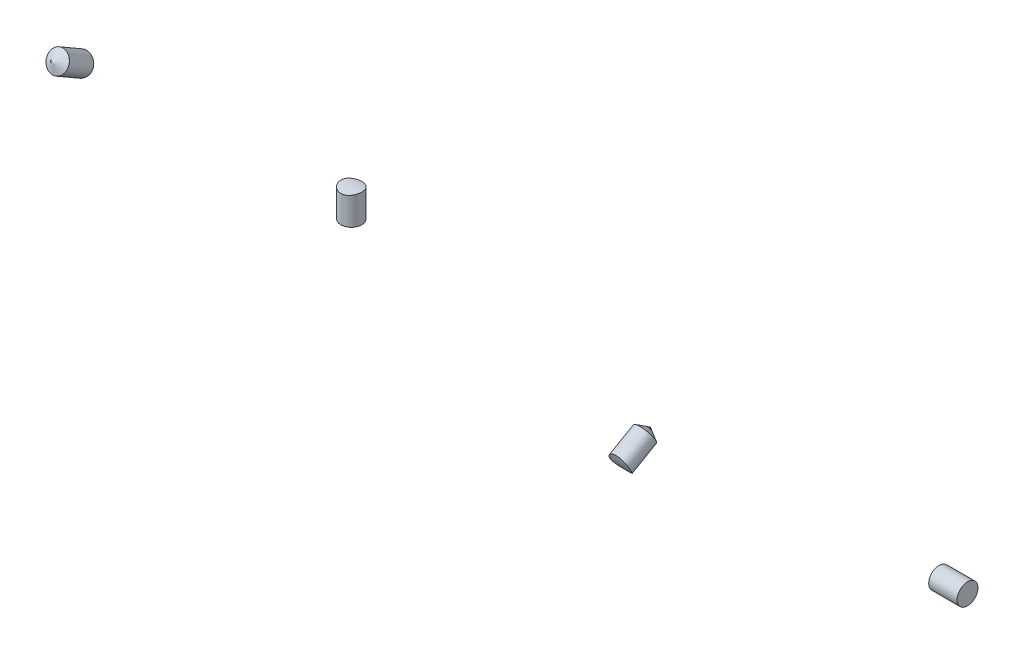
ISO-10303-21;
HEADER;
FILE_DESCRIPTION(('STEP AP214'),'2;1');
FILE_NAME('part.step','',(''),(''),'','','');
FILE_SCHEMA(('AUTOMOTIVE_DESIGN { 1 0 10303 214 1 1 1 1 }'));
ENDSEC;
DATA;
#1=APPLICATION_CONTEXT('core data for automotive mechanical design processes');
#2=APPLICATION_PROTOCOL_DEFINITION('international standard','automotive_design',2000,#1);
#3=PRODUCT_CONTEXT('',#1,'mechanical');
#4=PRODUCT('Part','Part','',(#3));
#5=PRODUCT_RELATED_PRODUCT_CATEGORY('part','',(#4));
#6=PRODUCT_DEFINITION_FORMATION('','',#4);
#7=PRODUCT_DEFINITION_CONTEXT('part definition',#1,'design');
#8=PRODUCT_DEFINITION('design','',#6,#7);
#9=PRODUCT_DEFINITION_SHAPE('','',#8);
#10=(LENGTH_UNIT() NAMED_UNIT(*) SI_UNIT(.MILLI.,.METRE.));
#11=(NAMED_UNIT(*) PLANE_ANGLE_UNIT() SI_UNIT($,.RADIAN.));
#12=(NAMED_UNIT(*) SI_UNIT($,.STERADIAN.) SOLID_ANGLE_UNIT());
#13=UNCERTAINTY_MEASURE_WITH_UNIT(LENGTH_MEASURE(1.E-05),#10,'distance_accuracy_value','');
#14=(GEOMETRIC_REPRESENTATION_CONTEXT(3) GLOBAL_UNCERTAINTY_ASSIGNED_CONTEXT((#13)) GLOBAL_UNIT_ASSIGNED_CONTEXT((#10,
#11,#12)) REPRESENTATION_CONTEXT('',''));
#15=CARTESIAN_POINT('',(0.,0.,0.));
#16=DIRECTION('',(0.,0.,1.));
#17=DIRECTION('',(1.,0.,0.));
#18=AXIS2_PLACEMENT_3D('',#15,#16,#17);
#19=CARTESIAN_POINT('',(40.,0.,0.));
#20=DIRECTION('',(1.,0.,0.));
#21=DIRECTION('',(0.,0.,-1.));
#22=AXIS2_PLACEMENT_3D('',#19,#20,#21);
#23=CYLINDRICAL_SURFACE('',#22,11.11);
#24=CARTESIAN_POINT('',(152.,10.8063400269471,2.57975099999999));
#25=CARTESIAN_POINT('',(151.857206050793,10.8063428862837,2.57974641586514));
#26=CARTESIAN_POINT('',(151.714358900543,10.8092011885388,2.56785478530721));
#27=CARTESIAN_POINT('',(151.432743410383,10.8203011987413,2.52066429695008));
#28=CARTESIAN_POINT('',(151.293977842589,10.8285464810255,2.48534989757816));
#29=CARTESIAN_POINT('',(151.02463969806,10.8494374219159,2.39249941788686));
#30=CARTESIAN_POINT('',(150.894057686016,10.8620778986246,2.33498949715904));
#31=CARTESIAN_POINT('',(150.644387625805,10.8903286486412,2.19945748182352));
#32=CARTESIAN_POINT('',(150.525299646415,10.9059389397179,2.12143526448626));
#33=CARTESIAN_POINT('',(150.299733288068,10.9387022961864,1.94551086880183));
#34=CARTESIAN_POINT('',(150.193505439678,10.9558771834862,1.8472914710587));
#35=CARTESIAN_POINT('',(149.998874304842,10.9896442531184,1.63444500352376));
#36=CARTESIAN_POINT('',(149.910472516096,11.0062363863927,1.51981655646825));
#37=CARTESIAN_POINT('',(149.752997693792,11.0372077284799,1.27571078381283));
#38=CARTESIAN_POINT('',(149.684167783989,11.0515581817236,1.14607265386879));
#39=CARTESIAN_POINT('',(149.569366717814,11.076181735565,0.876679472387452));
#40=CARTESIAN_POINT('',(149.523392663609,11.0864553530207,0.736925705960319));
#41=CARTESIAN_POINT('',(149.456402364187,11.1016134450636,0.453876370828853));
#42=CARTESIAN_POINT('',(149.434961479561,11.1065895049777,0.310686291301847));
#43=CARTESIAN_POINT('',(149.416316297768,11.1109098961663,0.0226609198655676));
#44=CARTESIAN_POINT('',(149.419108890977,11.1102549500079,-0.122174158576603));
#45=CARTESIAN_POINT('',(149.448539631683,11.1034563642158,-0.406443502490865));
#46=CARTESIAN_POINT('',(149.474719813022,11.0974181422326,-0.545928077395259));
#47=CARTESIAN_POINT('',(149.549450160758,11.0806526387213,-0.818467920294805));
#48=CARTESIAN_POINT('',(149.598001418691,11.0699251283937,-0.951522874224346));
#49=CARTESIAN_POINT('',(149.716486302235,11.0448202792495,-1.20867084500859));
#50=CARTESIAN_POINT('',(149.786589080656,11.0304142256219,-1.33268300379681));
#51=CARTESIAN_POINT('',(149.946060058163,10.9995250047272,-1.56734760252098));
#52=CARTESIAN_POINT('',(150.03543118902,10.9830415215282,-1.67799800540126));
#53=CARTESIAN_POINT('',(150.233379729815,10.9493479279752,-1.88552550388095));
#54=CARTESIAN_POINT('',(150.342357790233,10.9321298407197,-1.9820195149962));
#55=CARTESIAN_POINT('',(150.575128695024,10.8992656412505,-2.15544000981295));
#56=CARTESIAN_POINT('',(150.69892205105,10.8836195833619,-2.23236581743068));
#57=CARTESIAN_POINT('',(150.958483247955,10.8556464810749,-2.36466705241032));
#58=CARTESIAN_POINT('',(151.094293584359,10.8433318954023,-2.41996192092077));
#59=CARTESIAN_POINT('',(151.373634417675,10.823582600355,-2.50682367257596));
#60=CARTESIAN_POINT('',(151.517163510715,10.8161470068249,-2.53839485500243));
#61=CARTESIAN_POINT('',(151.804345387817,10.807180169168,-2.57630180031138));
#62=CARTESIAN_POINT('',(151.94792006057,10.8055176058561,-2.58319893604053));
#63=CARTESIAN_POINT('',(152.234167969219,10.8079294872424,-2.57308895719106));
#64=CARTESIAN_POINT('',(152.376841274749,10.8120034831845,-2.55608371243338));
#65=CARTESIAN_POINT('',(152.655228426144,10.8253046659429,-2.49914097846524));
#66=CARTESIAN_POINT('',(152.791010719891,10.8344606933179,-2.45951994643493));
#67=CARTESIAN_POINT('',(153.054008553654,10.8568286932612,-2.35881636077755));
#68=CARTESIAN_POINT('',(153.181223188372,10.8700410936268,-2.29773154341646));
#69=CARTESIAN_POINT('',(153.425882855137,10.8993166380453,-2.15462343079226));
#70=CARTESIAN_POINT('',(153.543122575351,10.9154248450417,-2.07225854526125));
#71=CARTESIAN_POINT('',(153.762322672498,10.9485616944089,-1.88936897420455));
#72=CARTESIAN_POINT('',(153.864280894622,10.9655904661266,-1.78884173204451));
#73=CARTESIAN_POINT('',(154.052242066214,10.9990876926289,-1.56992556981257));
#74=CARTESIAN_POINT('',(154.137859917599,11.0155365506156,-1.45120247803922));
#75=CARTESIAN_POINT('',(154.287938399714,11.0456426985676,-1.20073457681106));
#76=CARTESIAN_POINT('',(154.35240007783,11.0593001267166,-1.0689904124151));
#77=CARTESIAN_POINT('',(154.457819861664,11.0822028720258,-0.79708731353164));
#78=CARTESIAN_POINT('',(154.498936619729,11.0914778978613,-0.65699250825209));
#79=CARTESIAN_POINT('',(154.556987884387,11.1046999647698,-0.3716416829364));
#80=CARTESIAN_POINT('',(154.573926379692,11.108647884655,-0.226386518263246));
#81=CARTESIAN_POINT('',(154.582942058634,11.1107407431041,0.061522296610162));
#82=CARTESIAN_POINT('',(154.575591327805,11.1090192176647,0.204157355041313));
#83=CARTESIAN_POINT('',(154.537529598267,11.1002568785344,0.486100048694628));
#84=CARTESIAN_POINT('',(154.506819127578,11.093216185077,0.625407759054241));
#85=CARTESIAN_POINT('',(154.423198051676,11.0746210654453,0.89623339248588));
#86=CARTESIAN_POINT('',(154.37037796021,11.0630850556269,1.02778060871602));
#87=CARTESIAN_POINT('',(154.244121936876,11.0367237313327,1.28021670261093));
#88=CARTESIAN_POINT('',(154.170683740723,11.0218980556224,1.40110440772805));
#89=CARTESIAN_POINT('',(154.003460819088,10.9901763509542,1.63154903626519));
#90=CARTESIAN_POINT('',(153.909279510885,10.9732432408986,1.7408130918136));
#91=CARTESIAN_POINT('',(153.704031497188,10.9394004965377,1.94218085991952));
#92=CARTESIAN_POINT('',(153.592960651364,10.9224908690173,2.03428035237201));
#93=CARTESIAN_POINT('',(153.355014841942,10.8903149091664,2.20009166443159));
#94=CARTESIAN_POINT('',(153.227921633536,10.8750781044445,2.27349640705763));
#95=CARTESIAN_POINT('',(152.962869847239,10.8483540904598,2.39778753007626));
#96=CARTESIAN_POINT('',(152.824920043494,10.8368638911006,2.44869187921167));
#97=CARTESIAN_POINT('',(152.572482223884,10.8209240329103,2.5180680881973));
#98=CARTESIAN_POINT('',(152.459301323799,10.8154932854387,2.54115238568622));
#99=CARTESIAN_POINT('',(152.230758439936,10.8082002380442,2.5719952173753));
#100=CARTESIAN_POINT('',(152.115396592235,10.806337716221,2.57975470459352));
#101=CARTESIAN_POINT('',(152.,10.8063400269471,2.57975099999999));
#102=B_SPLINE_CURVE_WITH_KNOTS('',3,(#24,#25,#26,#27,#28,#29,#30,#31,#32,#33,#34,#35,#36,#37,
#38,#39,#40,#41,#42,#43,#44,#45,#46,#47,#48,#49,#50,#51,#52,#53,#54,#55,#56,#57,#58,#59,#60,#61,
#62,#63,#64,#65,#66,#67,#68,#69,#70,#71,#72,#73,#74,#75,#76,#77,#78,#79,#80,#81,#82,#83,#84,#85,
#86,#87,#88,#89,#90,#91,#92,#93,#94,#95,#96,#97,#98,#99,#100,#101),.UNSPECIFIED.,.T.,.F.,(4,2,2,
2,2,2,2,2,2,2,2,2,2,2,2,2,2,2,2,2,2,2,2,2,2,2,2,2,2,2,2,2,2,2,2,2,2,2,4),(0.,0.42795858924377,
0.856201423798316,1.28394106610051,1.71168326772106,2.14674201170975,2.58183729299628,
3.02212224474731,3.46235135968424,3.89483955494707,4.32727225443571,4.75141845725171,
5.17558535730033,5.60317032170868,6.03082039115803,6.46848201566221,6.90615875937449,
7.34545034265557,7.78466229690882,8.21381559615043,8.64293532571611,9.06619273657193,
9.48949480077892,9.92006687005439,10.3506995963391,10.7904834385017,11.2302455048545,
11.666982027164,12.103646492269,12.5301001626726,12.9565441938703,13.3812592371416,
13.8060209409947,14.2397442886435,14.6735741318884,15.1141271358033,15.5543276770175,
15.9001969139619,16.2460446413408),.UNSPECIFIED.);
#103=CARTESIAN_POINT('',(152.,10.8063400269471,2.57975099999999));
#104=VERTEX_POINT('',#103);
#105=EDGE_CURVE('E12',#104,#104,#102,.T.);
#106=ORIENTED_EDGE('',*,*,#105,.F.);
#107=EDGE_LOOP('',(#106));
#108=FACE_BOUND('',#107,.T.);
#109=ADVANCED_FACE('F48',(#108),#23,.T.);
#110=CARTESIAN_POINT('',(152.,11.11,0.));
#111=DIRECTION('',(0.,1.,0.));
#112=DIRECTION('',(0.,0.,1.));
#113=AXIS2_PLACEMENT_3D('',#110,#111,#112);
#114=CYLINDRICAL_SURFACE('',#113,2.57975099999999);
#115=CARTESIAN_POINT('',(152.,4.11,0.));
#116=DIRECTION('',(0.,1.,0.));
#117=DIRECTION('',(0.,0.,1.));
#118=AXIS2_PLACEMENT_3D('',#115,#116,#117);
#119=CIRCLE('',#118,2.57975099999999);
#120=CARTESIAN_POINT('',(152.,4.11,2.57975099999999));
#121=VERTEX_POINT('',#120);
#122=EDGE_CURVE('E52',#121,#121,#119,.T.);
#123=ORIENTED_EDGE('',*,*,#122,.T.);
#124=EDGE_LOOP('',(#123));
#125=FACE_BOUND('',#124,.T.);
#126=ORIENTED_EDGE('',*,*,#105,.T.);
#127=EDGE_LOOP('',(#126));
#128=FACE_BOUND('',#127,.T.);
#129=ADVANCED_FACE('F61',(#125,#128),#114,.T.);
#130=CARTESIAN_POINT('',(152.,4.11,0.));
#131=DIRECTION('',(0.,1.,0.));
#132=DIRECTION('',(0.,0.,1.));
#133=AXIS2_PLACEMENT_3D('',#130,#131,#132);
#134=CONICAL_SURFACE('',#133,2.57975099999999,1.02974425867665);
#135=CARTESIAN_POINT('',(152.,2.55992921720303,0.));
#136=VERTEX_POINT('',#135);
#137=VERTEX_LOOP('',#136);
#138=FACE_BOUND('',#137,.T.);
#139=ORIENTED_EDGE('',*,*,#122,.F.);
#140=EDGE_LOOP('',(#139));
#141=FACE_BOUND('',#140,.T.);
#142=ADVANCED_FACE('F58',(#138,#141),#134,.T.);
#143=CLOSED_SHELL('',(#109,#129,#142));
#144=MANIFOLD_SOLID_BREP('B2',#143);
#145=CARTESIAN_POINT('',(304.,0.,0.));
#146=DIRECTION('',(1.,0.,0.));
#147=DIRECTION('',(0.,0.,-1.));
#148=AXIS2_PLACEMENT_3D('',#145,#146,#147);
#149=PLANE('',#148);
#150=CARTESIAN_POINT('',(304.,0.,0.));
#151=DIRECTION('',(1.,0.,0.));
#152=DIRECTION('',(0.,0.,-1.));
#153=AXIS2_PLACEMENT_3D('',#150,#151,#152);
#154=CIRCLE('',#153,2.57975099999999);
#155=CARTESIAN_POINT('',(304.,0.,-2.57975099999999));
#156=VERTEX_POINT('',#155);
#157=EDGE_CURVE('E113',#156,#156,#154,.T.);
#158=ORIENTED_EDGE('',*,*,#157,.T.);
#159=EDGE_LOOP('',(#158));
#160=FACE_BOUND('',#159,.T.);
#161=ADVANCED_FACE('F109',(#160),#149,.T.);
#162=CARTESIAN_POINT('',(297.,0.,0.));
#163=DIRECTION('',(1.,0.,0.));
#164=DIRECTION('',(0.,0.,-1.));
#165=AXIS2_PLACEMENT_3D('',#162,#163,#164);
#166=CONICAL_SURFACE('',#165,2.57975099999999,1.02974425867666);
#167=CARTESIAN_POINT('',(295.449929217203,0.,0.));
#168=VERTEX_POINT('',#167);
#169=VERTEX_LOOP('',#168);
#170=FACE_BOUND('',#169,.T.);
#171=CARTESIAN_POINT('',(297.,0.,0.));
#172=DIRECTION('',(1.,0.,0.));
#173=DIRECTION('',(0.,0.,-1.));
#174=AXIS2_PLACEMENT_3D('',#171,#172,#173);
#175=CIRCLE('',#174,2.57975099999999);
#176=CARTESIAN_POINT('',(297.,0.,-2.57975099999999));
#177=VERTEX_POINT('',#176);
#178=EDGE_CURVE('E46',#177,#177,#175,.T.);
#179=ORIENTED_EDGE('',*,*,#178,.F.);
#180=EDGE_LOOP('',(#179));
#181=FACE_BOUND('',#180,.T.);
#182=ADVANCED_FACE('F119',(#170,#181),#166,.T.);
#183=CARTESIAN_POINT('',(304.,0.,0.));
#184=DIRECTION('',(1.,0.,0.));
#185=DIRECTION('',(0.,0.,-1.));
#186=AXIS2_PLACEMENT_3D('',#183,#184,#185);
#187=CYLINDRICAL_SURFACE('',#186,2.57975099999999);
#188=ORIENTED_EDGE('',*,*,#178,.T.);
#189=EDGE_LOOP('',(#188));
#190=FACE_BOUND('',#189,.T.);
#191=ORIENTED_EDGE('',*,*,#157,.F.);
#192=EDGE_LOOP('',(#191));
#193=FACE_BOUND('',#192,.T.);
#194=ADVANCED_FACE('F111',(#190,#193),#187,.T.);
#195=CLOSED_SHELL('',(#161,#182,#194));
#196=MANIFOLD_SOLID_BREP('B6',#195);
#197=CARTESIAN_POINT('',(40.,0.,0.));
#198=DIRECTION('',(1.,0.,0.));
#199=DIRECTION('',(0.,0.,-1.));
#200=AXIS2_PLACEMENT_3D('',#197,#198,#199);
#201=CYLINDRICAL_SURFACE('',#200,11.11);
#202=CARTESIAN_POINT('',(228.,-7.63729991491183,8.06868948526883));
#203=CARTESIAN_POINT('',(227.857206050793,-7.63729737460289,8.06869425359438));
#204=CARTESIAN_POINT('',(227.714358900543,-7.62842807157487,8.07711543123798));
#205=CARTESIAN_POINT('',(227.432743410383,-7.59310991494183,8.11032356623413));
#206=CARTESIAN_POINT('',(227.293977842589,-7.5666493891085,8.13512138983964));
#207=CARTESIAN_POINT('',(227.02463969806,-7.49668398538741,8.19963871520527));
#208=CARTESIAN_POINT('',(226.894057686016,-7.45319917142187,8.23934064951492));
#209=CARTESIAN_POINT('',(226.644387625805,-7.34995037812349,8.33157252437299));
#210=CARTESIAN_POINT('',(226.525299646415,-7.29018630138817,8.3841025416745));
#211=CARTESIAN_POINT('',(226.299733288068,-7.15421298381429,8.50043863853168));
#212=CARTESIAN_POINT('',(226.193505439678,-7.07773993387425,8.56442222611203));
#213=CARTESIAN_POINT('',(225.998874304842,-6.91029302069932,8.70008859999237));
#214=CARTESIAN_POINT('',(225.910472516096,-6.81931794019003,8.77177203243862));
#215=CARTESIAN_POINT('',(225.752997693792,-6.62340181090361,8.92064688780315));
#216=CARTESIAN_POINT('',(225.684167783989,-6.51830712369479,8.99789380984));
#217=CARTESIAN_POINT('',(225.569366717814,-6.29731756184636,9.15391502373882));
#218=CARTESIAN_POINT('',(225.523392663609,-6.18142405857377,9.23268912065779));
#219=CARTESIAN_POINT('',(225.456402364187,-5.94387518984704,9.38734108100553));
#220=CARTESIAN_POINT('',(225.434961479561,-5.82235697336378,9.46324551506538));
#221=CARTESIAN_POINT('',(225.416316297768,-5.57507988035985,9.6109997693072));
#222=CARTESIAN_POINT('',(225.419108890977,-5.44932154999062,9.68285010851701));
#223=CARTESIAN_POINT('',(225.448539631683,-5.19973778374768,9.81909703246836));
#224=CARTESIAN_POINT('',(225.474719813022,-5.07592148745279,9.8836100662894));
#225=CARTESIAN_POINT('',(225.549450160758,-4.83151230820271,10.0053606357911));
#226=CARTESIAN_POINT('',(225.598001418691,-4.71091958283654,10.0625978162928));
#227=CARTESIAN_POINT('',(225.716486302235,-4.47567048303367,10.1694303645679));
#228=CARTESIAN_POINT('',(225.786589080656,-4.36106977633113,10.2189604355522));
#229=CARTESIAN_POINT('',(225.946060058163,-4.14239966201978,10.3095418849164));
#230=CARTESIAN_POINT('',(226.03543118902,-4.03833186058697,10.3505919711634));
#231=CARTESIAN_POINT('',(226.233379729815,-3.84176097814323,10.4251762124415));
#232=CARTESIAN_POINT('',(226.342357790233,-3.74958566957661,10.4585119170313));
#233=CARTESIAN_POINT('',(226.575128695024,-3.58296701579384,10.5167609328243));
#234=CARTESIAN_POINT('',(226.69892205105,-3.50852428324596,10.5416739530326));
#235=CARTESIAN_POINT('',(226.958483247955,-3.37996150165802,10.5835991533192));
#236=CARTESIAN_POINT('',(227.094293584359,-3.32591744799275,10.6005818435449));
#237=CARTESIAN_POINT('',(227.373634417675,-3.2408183169185,10.6269093281547));
#238=CARTESIAN_POINT('',(227.517163510715,-3.20975907414459,10.6362555064786));
#239=CARTESIAN_POINT('',(227.804345387817,-3.17244727769871,10.6474434699306));
#240=CARTESIAN_POINT('',(227.94792006057,-3.165642901288,10.6494522157317));
#241=CARTESIAN_POINT('',(228.234167969219,-3.17560434049653,10.6464859768584));
#242=CARTESIAN_POINT('',(228.376841274749,-3.19236831242531,10.6415115384603));
#243=CARTESIAN_POINT('',(228.655228426144,-3.24833275798181,10.6245593336454));
#244=CARTESIAN_POINT('',(228.791010719891,-3.28722359193175,10.6126781699347));
#245=CARTESIAN_POINT('',(229.054008553654,-3.38561945533486,10.5816976332888));
#246=CARTESIAN_POINT('',(229.181223188372,-3.4451266591379,10.5625974989698));
#247=CARTESIAN_POINT('',(229.425882855137,-3.58369969236734,10.5163968078337));
#248=CARTESIAN_POINT('',(229.543122575351,-3.6630838791152,10.4891644815366));
#249=CARTESIAN_POINT('',(229.762322672498,-3.83803931842112,10.4264170493616));
#250=CARTESIAN_POINT('',(229.864280894622,-3.93361284976298,10.3909007771843));
#251=CARTESIAN_POINT('',(230.052242066214,-4.13994842080595,10.3104521451756));
#252=CARTESIAN_POINT('',(230.137859917599,-4.25099006329087,10.2653357281687));
#253=CARTESIAN_POINT('',(230.287938399714,-4.48295470256306,10.1661744664912));
#254=CARTESIAN_POINT('',(230.35240007783,-4.60387720980478,10.1121300640206));
#255=CARTESIAN_POINT('',(230.457819861664,-4.85080357346019,9.99601287383305));
#256=CARTESIAN_POINT('',(230.498936619729,-4.97676674668828,9.93399787918759));
#257=CARTESIAN_POINT('',(230.556987884387,-5.23049884385673,9.80277311236298));
#258=CARTESIAN_POINT('',(230.573926379692,-5.35826746643718,9.73356452893909));
#259=CARTESIAN_POINT('',(230.582942058634,-5.60865024331557,9.59142259008584));
#260=CARTESIAN_POINT('',(230.575591327805,-5.73131506466755,9.51861417610653));
#261=CARTESIAN_POINT('',(230.537529598267,-5.97110343021756,9.3700544209964));
#262=CARTESIAN_POINT('',(230.506819127578,-6.08822709960335,9.29430314642227));
#263=CARTESIAN_POINT('',(230.423198051676,-6.31347141833531,9.14278648371898));
#264=CARTESIAN_POINT('',(230.37037796021,-6.42162664447853,9.06702239804286));
#265=CARTESIAN_POINT('',(230.244121936876,-6.62706205247653,8.91797477457922));
#266=CARTESIAN_POINT('',(230.170683740723,-6.724341038258,8.84469151022727));
#267=CARTESIAN_POINT('',(230.003460819088,-6.90805108840274,8.7019973938647));
#268=CARTESIAN_POINT('',(229.909279510885,-6.99420998120042,8.63270086261733));
#269=CARTESIAN_POINT('',(229.704031497188,-7.15167821170303,8.50270830221399));
#270=CARTESIAN_POINT('',(229.592960651364,-7.22298389808235,8.44201438898656));
#271=CARTESIAN_POINT('',(229.355014841942,-7.35049272663532,8.33124353433473));
#272=CARTESIAN_POINT('',(229.227921633536,-7.4064446961468,8.28134570306007));
#273=CARTESIAN_POINT('',(228.962869847239,-7.50072195915349,8.19605646654894));
#274=CARTESIAN_POINT('',(228.824920043494,-7.53906131898824,8.16065348744158));
#275=CARTESIAN_POINT('',(228.572482223884,-7.59117294929293,8.11216106082328));
#276=CARTESIAN_POINT('',(228.459301323799,-7.60844916361104,8.09591574680687));
#277=CARTESIAN_POINT('',(228.230758439936,-7.63151331568119,8.0741783666477));
#278=CARTESIAN_POINT('',(228.115396592235,-7.63730196782091,8.0686856318246));
#279=CARTESIAN_POINT('',(228.,-7.63729991491183,8.06868948526883));
#280=B_SPLINE_CURVE_WITH_KNOTS('',3,(#202,#203,#204,#205,#206,#207,#208,#209,#210,#211,#212,
#213,#214,#215,#216,#217,#218,#219,#220,#221,#222,#223,#224,#225,#226,#227,#228,#229,#230,#231,
#232,#233,#234,#235,#236,#237,#238,#239,#240,#241,#242,#243,#244,#245,#246,#247,#248,#249,#250,
#251,#252,#253,#254,#255,#256,#257,#258,#259,#260,#261,#262,#263,#264,#265,#266,#267,#268,#269,
#270,#271,#272,#273,#274,#275,#276,#277,#278,#279),.UNSPECIFIED.,.T.,.F.,(4,2,2,2,2,2,2,2,2,2,2,
2,2,2,2,2,2,2,2,2,2,2,2,2,2,2,2,2,2,2,2,2,2,2,2,2,2,2,4),(0.,0.427958589243742,
0.856201423798316,1.28394106610051,1.71168326772106,2.14674201170975,2.58183729299628,
3.02212224474731,3.46235135968424,3.89483955494707,4.32727225443571,4.75141845725171,
5.17558535730033,5.60317032170868,6.03082039115803,6.46848201566221,6.90615875937449,
7.34545034265557,7.78466229690882,8.21381559615048,8.64293532571614,9.06619273657193,
9.48949480077892,9.92006687005439,10.3506995963391,10.7904834385017,11.2302455048545,
11.666982027164,12.1036464922691,12.5301001626726,12.9565441938703,13.3812592371416,
13.8060209409947,14.2397442886435,14.6735741318884,15.1141271358033,15.5543276770175,
15.9001969139619,16.2460446413408),.UNSPECIFIED.);
#281=CARTESIAN_POINT('',(228.,-7.63729991491183,8.06868948526883));
#282=VERTEX_POINT('',#281);
#283=EDGE_CURVE('E107',#282,#282,#280,.T.);
#284=ORIENTED_EDGE('',*,*,#283,.F.);
#285=EDGE_LOOP('',(#284));
#286=FACE_BOUND('',#285,.T.);
#287=ADVANCED_FACE('F164',(#286),#201,.T.);
#288=CARTESIAN_POINT('',(228.,-2.05499999999999,3.55936440955405));
#289=DIRECTION('',(0.,-0.499999999999998,0.86602540378444));
#290=DIRECTION('',(0.,-0.86602540378444,-0.499999999999998));
#291=AXIS2_PLACEMENT_3D('',#288,#289,#290);
#292=CONICAL_SURFACE('',#291,2.57975099999999,1.02974425867665);
#293=CARTESIAN_POINT('',(228.,-1.27996460860151,2.21696373398784));
#294=VERTEX_POINT('',#293);
#295=VERTEX_LOOP('',#294);
#296=FACE_BOUND('',#295,.T.);
#297=CARTESIAN_POINT('',(228.,-2.05499999999999,3.55936440955405));
#298=DIRECTION('',(0.,-0.499999999999998,0.86602540378444));
#299=DIRECTION('',(0.,-0.86602540378444,-0.499999999999998));
#300=AXIS2_PLACEMENT_3D('',#297,#298,#299);
#301=CIRCLE('',#300,2.57975099999999);
#302=CARTESIAN_POINT('',(228.,-4.2891299014383,2.26948890955406));
#303=VERTEX_POINT('',#302);
#304=EDGE_CURVE('E168',#303,#303,#301,.T.);
#305=ORIENTED_EDGE('',*,*,#304,.F.);
#306=EDGE_LOOP('',(#305));
#307=FACE_BOUND('',#306,.T.);
#308=ADVANCED_FACE('F174',(#296,#307),#292,.T.);
#309=CARTESIAN_POINT('',(228.,-5.55499999999998,9.62154223604513));
#310=DIRECTION('',(0.,-0.499999999999998,0.86602540378444));
#311=DIRECTION('',(0.,-0.86602540378444,-0.499999999999998));
#312=AXIS2_PLACEMENT_3D('',#309,#310,#311);
#313=CYLINDRICAL_SURFACE('',#312,2.57975099999999);
#314=ORIENTED_EDGE('',*,*,#304,.T.);
#315=EDGE_LOOP('',(#314));
#316=FACE_BOUND('',#315,.T.);
#317=ORIENTED_EDGE('',*,*,#283,.T.);
#318=EDGE_LOOP('',(#317));
#319=FACE_BOUND('',#318,.T.);
#320=ADVANCED_FACE('F177',(#316,#319),#313,.T.);
#321=CLOSED_SHELL('',(#287,#308,#320));
#322=MANIFOLD_SOLID_BREP('B40',#321);
#323=CARTESIAN_POINT('',(40.,0.,0.));
#324=DIRECTION('',(1.,0.,0.));
#325=DIRECTION('',(0.,0.,-1.));
#326=AXIS2_PLACEMENT_3D('',#323,#324,#325);
#327=CYLINDRICAL_SURFACE('',#326,11.11);
#328=CARTESIAN_POINT('',(76.,-3.16904011203537,-10.6484404852688));
#329=CARTESIAN_POINT('',(75.8572060507933,-3.1690455116809,-10.6484406694595));
#330=CARTESIAN_POINT('',(75.7143589005434,-3.18077311696405,-10.6449702165451));
#331=CARTESIAN_POINT('',(75.4327434103829,-3.22719128379955,-10.6309878631842));
#332=CARTESIAN_POINT('',(75.2939778425891,-3.26189709191716,-10.6204712874178));
#333=CARTESIAN_POINT('',(75.0246396980597,-3.35275343652855,-10.5921381330921));
#334=CARTESIAN_POINT('',(74.8940576860156,-3.40887872720286,-10.5743301466739));
#335=CARTESIAN_POINT('',(74.6443876258045,-3.54037827051779,-10.5310300061965));
#336=CARTESIAN_POINT('',(74.5252996464148,-3.6157526383298,-10.5055378061607));
#337=CARTESIAN_POINT('',(74.2997332880682,-3.78448931237219,-10.4459495073334));
#338=CARTESIAN_POINT('',(74.1935054396783,-3.87813724961207,-10.4117136971707));
#339=CARTESIAN_POINT('',(73.9988743048423,-4.07935123241923,-10.3345336035161));
#340=CARTESIAN_POINT('',(73.9104725160956,-4.1869184462028,-10.2915885889068));
#341=CARTESIAN_POINT('',(73.7529976937924,-4.41380591757643,-10.1963576716159));
#342=CARTESIAN_POINT('',(73.6841677839891,-4.53325105802891,-10.1439664637087));
#343=CARTESIAN_POINT('',(73.5693667178144,-4.77886417371878,-10.0305944961262));
#344=CARTESIAN_POINT('',(73.5233926636093,-4.90503129444709,-9.96961482661803));
#345=CARTESIAN_POINT('',(73.4564023641869,-5.15773825521666,-9.8412174518343));
#346=CARTESIAN_POINT('',(73.4349614795613,-5.284232531614,-9.77393180636714));
#347=CARTESIAN_POINT('',(73.4163162977682,-5.5358300158066,-9.63366068917267));
#348=CARTESIAN_POINT('',(73.4191088909771,-5.66093340001743,-9.56067594994031));
#349=CARTESIAN_POINT('',(73.4485396316833,-5.90371858046826,-9.4126535299774));
#350=CARTESIAN_POINT('',(73.4747198130217,-6.02149665477992,-9.33768198889405));
#351=CARTESIAN_POINT('',(73.549450160758,-6.24914033051869,-9.18689271549623));
#352=CARTESIAN_POINT('',(73.5980014186907,-6.35900554555722,-9.11107494206836));
#353=CARTESIAN_POINT('',(73.7164863022345,-6.5691497962159,-8.9607595195592));
#354=CARTESIAN_POINT('',(73.7865890806561,-6.66934444929085,-8.88627743175531));
#355=CARTESIAN_POINT('',(73.9460600581635,-6.85712534270754,-8.74219428239535));
#356=CARTESIAN_POINT('',(74.03543118902,-6.94470966094133,-8.672593965762));
#357=CARTESIAN_POINT('',(74.2333797298153,-7.10758694983208,-8.53965070856048));
#358=CARTESIAN_POINT('',(74.3423577902326,-7.1825441711432,-8.47649240203501));
#359=CARTESIAN_POINT('',(74.5751286950235,-7.31629862545677,-8.36132092301127));
#360=CARTESIAN_POINT('',(74.6989220510502,-7.37509530011606,-8.3093081356018));
#361=CARTESIAN_POINT('',(74.9584832479553,-7.47568497941696,-8.21893210090876));
#362=CARTESIAN_POINT('',(75.0942935843588,-7.51741444740963,-8.18061992262399));
#363=CARTESIAN_POINT('',(75.3736344176745,-7.5827642834366,-8.12008565557861));
#364=CARTESIAN_POINT('',(75.5171635107147,-7.60638793268036,-8.09786065147606));
#365=CARTESIAN_POINT('',(75.8043453878175,-7.63473289146931,-8.07114166961908));
#366=CARTESIAN_POINT('',(75.9479200605705,-7.63987470456819,-8.06625327969106));
#367=CARTESIAN_POINT('',(76.2341679692192,-7.63232514674598,-8.07339701966726));
#368=CARTESIAN_POINT('',(76.3768412747495,-7.6196351707593,-8.08542782602688));
#369=CARTESIAN_POINT('',(76.6552284261438,-7.57697190796112,-8.12541835518003));
#370=CARTESIAN_POINT('',(76.7910107198912,-7.54723710138624,-8.15315822349973));
#371=CARTESIAN_POINT('',(77.054008553654,-7.47120923792642,-8.22288127251115));
#372=CARTESIAN_POINT('',(77.1812231883717,-7.42491443448897,-8.26486595555329));
#373=CARTESIAN_POINT('',(77.4258828551373,-7.31561694567799,-8.36177337704141));
#374=CARTESIAN_POINT('',(77.5431225753507,-7.25234096592657,-8.41690593627526));
#375=CARTESIAN_POINT('',(77.762322672498,-7.1105223759878,-8.53704807515694));
#376=CARTESIAN_POINT('',(77.8642808946216,-7.03197761636368,-8.60205904513976));
#377=CARTESIAN_POINT('',(78.0522420662138,-6.85913927182295,-8.740526575363));
#378=CARTESIAN_POINT('',(78.1378599175985,-6.76454648732477,-8.81413325012943));
#379=CARTESIAN_POINT('',(78.2879383997138,-6.56268799600463,-8.96543988968008));
#380=CARTESIAN_POINT('',(78.3524000778301,-6.45542291691184,-9.0431396516054));
#381=CARTESIAN_POINT('',(78.4578198616638,-6.23139929856568,-9.19892556030135));
#382=CARTESIAN_POINT('',(78.4989366197287,-6.11471115117311,-9.27700537093543));
#383=CARTESIAN_POINT('',(78.5569878843866,-5.87420112091309,-9.43113142942651));
#384=CARTESIAN_POINT('',(78.5739263796925,-5.75038041821785,-9.50717801067578));
#385=CARTESIAN_POINT('',(78.582942058634,-5.50209049978856,-9.65294488669593));
#386=CARTESIAN_POINT('',(78.575591327805,-5.37770415299724,-9.72277153114778));
#387=CARTESIAN_POINT('',(78.5375295982668,-5.12915344831687,-9.85615446969097));
#388=CARTESIAN_POINT('',(78.5068191275776,-5.00498908547372,-9.91971090547645));
#389=CARTESIAN_POINT('',(78.4231980516757,-4.76114964711006,-10.0390198762048));
#390=CARTESIAN_POINT('',(78.3703779602095,-4.64145841114844,-10.0948030067588));
#391=CARTESIAN_POINT('',(78.244121936876,-4.40966167885623,-10.1981914771901));
#392=CARTESIAN_POINT('',(78.1706837407226,-4.29755701736445,-10.2457959179553));
#393=CARTESIAN_POINT('',(78.0034608190883,-4.08212526255152,-10.3335464301298));
#394=CARTESIAN_POINT('',(77.9092795108853,-3.97903325969831,-10.3735139544309));
#395=CARTESIAN_POINT('',(77.704031497188,-3.78772228483473,-10.4448891621335));
#396=CARTESIAN_POINT('',(77.5929606513638,-3.69950697093504,-10.4762947413585));
#397=CARTESIAN_POINT('',(77.3550148419421,-3.53982218253116,-10.5313351987663));
#398=CARTESIAN_POINT('',(77.2279216335358,-3.46863340829782,-10.5548421101176));
#399=CARTESIAN_POINT('',(76.9628698472392,-3.34763213130646,-10.5938439966251));
#400=CARTESIAN_POINT('',(76.8249200434941,-3.29780257211245,-10.6093453666532));
#401=CARTESIAN_POINT('',(76.5724822238841,-3.22975108361751,-10.6302291490205));
#402=CARTESIAN_POINT('',(76.4593013237994,-3.20704412182779,-10.637068132493));
#403=CARTESIAN_POINT('',(76.2307584399355,-3.17668692236315,-10.6461735840229));
#404=CARTESIAN_POINT('',(76.1153965922354,-3.16903574840024,-10.6484403364181));
#405=CARTESIAN_POINT('',(76.,-3.16904011203537,-10.6484404852688));
#406=B_SPLINE_CURVE_WITH_KNOTS('',3,(#328,#329,#330,#331,#332,#333,#334,#335,#336,#337,#338,
#339,#340,#341,#342,#343,#344,#345,#346,#347,#348,#349,#350,#351,#352,#353,#354,#355,#356,#357,
#358,#359,#360,#361,#362,#363,#364,#365,#366,#367,#368,#369,#370,#371,#372,#373,#374,#375,#376,
#377,#378,#379,#380,#381,#382,#383,#384,#385,#386,#387,#388,#389,#390,#391,#392,#393,#394,#395,
#396,#397,#398,#399,#400,#401,#402,#403,#404,#405),.UNSPECIFIED.,.T.,.F.,(4,2,2,2,2,2,2,2,2,2,2,
2,2,2,2,2,2,2,2,2,2,2,2,2,2,2,2,2,2,2,2,2,2,2,2,2,2,2,4),(0.,0.427958589243783,
0.856201423798331,1.2839410661005,1.71168326772106,2.14674201170974,2.58183729299632,
3.02212224474733,3.46235135968427,3.89483955494709,4.32727225443574,4.75141845725173,
5.17558535730036,5.60317032170872,6.03082039115806,6.46848201566223,6.90615875937452,
7.3454503426556,7.78466229690887,8.21381559615049,8.64293532571611,9.06619273657193,
9.48949480077898,9.92006687005444,10.3506995963391,10.7904834385018,11.2302455048546,
11.6669820271641,12.1036464922691,12.5301001626727,12.9565441938703,13.3812592371416,
13.8060209409948,14.2397442886435,14.6735741318884,15.1141271358033,15.5543276770176,
15.9001969139619,16.2460446413408),.UNSPECIFIED.);
#407=CARTESIAN_POINT('',(76.,-3.16904011203537,-10.6484404852688));
#408=VERTEX_POINT('',#407);
#409=EDGE_CURVE('E162',#408,#408,#406,.T.);
#410=ORIENTED_EDGE('',*,*,#409,.F.);
#411=EDGE_LOOP('',(#410));
#412=FACE_BOUND('',#411,.T.);
#413=ADVANCED_FACE('F215',(#412),#327,.T.);
#414=CARTESIAN_POINT('',(76.,-2.05500000000004,-3.55936440955402));
#415=DIRECTION('',(0.,-0.50000000000001,-0.866025403784433));
#416=DIRECTION('',(0.,0.866025403784433,-0.50000000000001));
#417=AXIS2_PLACEMENT_3D('',#414,#415,#416);
#418=CONICAL_SURFACE('',#417,2.57975099999999,1.02974425867665);
#419=CARTESIAN_POINT('',(76.,-1.27996460860154,-2.21696373398783));
#420=VERTEX_POINT('',#419);
#421=VERTEX_LOOP('',#420);
#422=FACE_BOUND('',#421,.T.);
#423=CARTESIAN_POINT('',(76.,-2.05500000000004,-3.55936440955402));
#424=DIRECTION('',(0.,-0.50000000000001,-0.866025403784433));
#425=DIRECTION('',(0.,0.866025403784433,-0.50000000000001));
#426=AXIS2_PLACEMENT_3D('',#423,#424,#425);
#427=CIRCLE('',#426,2.57975099999999);
#428=CARTESIAN_POINT('',(76.,0.179129901438243,-4.84923990955405));
#429=VERTEX_POINT('',#428);
#430=EDGE_CURVE('E224',#429,#429,#427,.T.);
#431=ORIENTED_EDGE('',*,*,#430,.F.);
#432=EDGE_LOOP('',(#431));
#433=FACE_BOUND('',#432,.T.);
#434=ADVANCED_FACE('F227',(#422,#433),#418,.T.);
#435=CARTESIAN_POINT('',(76.,-5.55500000000011,-9.62154223604506));
#436=DIRECTION('',(0.,-0.50000000000001,-0.866025403784433));
#437=DIRECTION('',(0.,0.866025403784433,-0.50000000000001));
#438=AXIS2_PLACEMENT_3D('',#435,#436,#437);
#439=CYLINDRICAL_SURFACE('',#438,2.57975099999999);
#440=ORIENTED_EDGE('',*,*,#430,.T.);
#441=EDGE_LOOP('',(#440));
#442=FACE_BOUND('',#441,.T.);
#443=ORIENTED_EDGE('',*,*,#409,.T.);
#444=EDGE_LOOP('',(#443));
#445=FACE_BOUND('',#444,.T.);
#446=ADVANCED_FACE('F230',(#442,#445),#439,.T.);
#447=CLOSED_SHELL('',(#413,#434,#446));
#448=MANIFOLD_SOLID_BREP('B101',#447);
#449=ADVANCED_BREP_SHAPE_REPRESENTATION('',(#18,#144,#196,#322,#448),#14);
#450=SHAPE_DEFINITION_REPRESENTATION(#9,#449);
ENDSEC;
END-ISO-10303-21;
